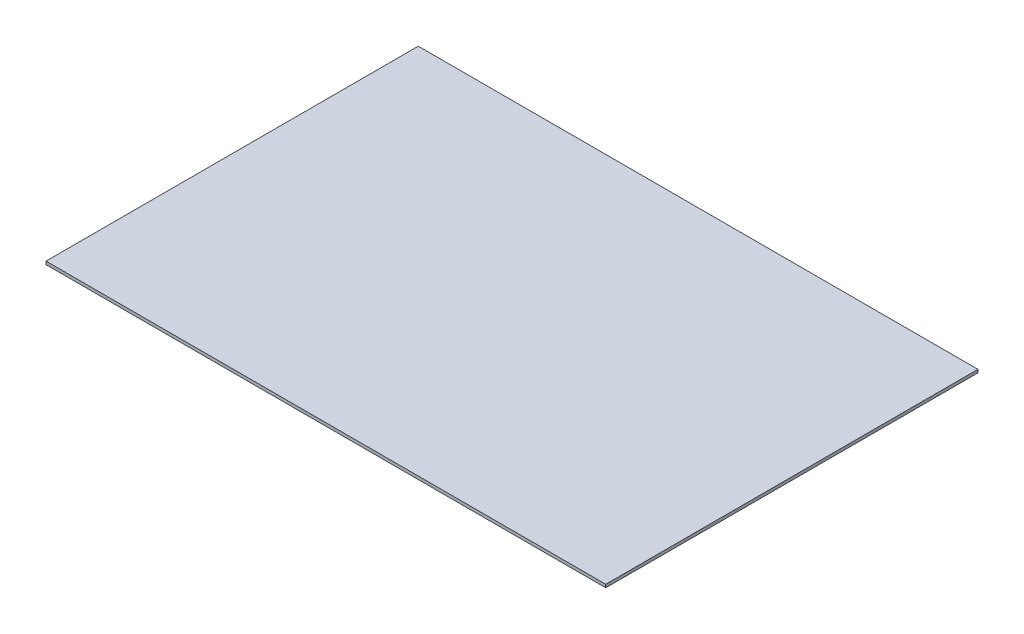
ISO-10303-21;
HEADER;
FILE_DESCRIPTION(('STEP AP214'),'2;1');
FILE_NAME('part.step','',(''),(''),'','','');
FILE_SCHEMA(('AUTOMOTIVE_DESIGN { 1 0 10303 214 1 1 1 1 }'));
ENDSEC;
DATA;
#1=APPLICATION_CONTEXT('core data for automotive mechanical design processes');
#2=APPLICATION_PROTOCOL_DEFINITION('international standard','automotive_design',2000,#1);
#3=PRODUCT_CONTEXT('',#1,'mechanical');
#4=PRODUCT('Part','Part','',(#3));
#5=PRODUCT_RELATED_PRODUCT_CATEGORY('part','',(#4));
#6=PRODUCT_DEFINITION_FORMATION('','',#4);
#7=PRODUCT_DEFINITION_CONTEXT('part definition',#1,'design');
#8=PRODUCT_DEFINITION('design','',#6,#7);
#9=PRODUCT_DEFINITION_SHAPE('','',#8);
#10=(LENGTH_UNIT() NAMED_UNIT(*) SI_UNIT(.MILLI.,.METRE.));
#11=(NAMED_UNIT(*) PLANE_ANGLE_UNIT() SI_UNIT($,.RADIAN.));
#12=(NAMED_UNIT(*) SI_UNIT($,.STERADIAN.) SOLID_ANGLE_UNIT());
#13=UNCERTAINTY_MEASURE_WITH_UNIT(LENGTH_MEASURE(1.E-05),#10,'distance_accuracy_value','');
#14=(GEOMETRIC_REPRESENTATION_CONTEXT(3) GLOBAL_UNCERTAINTY_ASSIGNED_CONTEXT((#13)) GLOBAL_UNIT_ASSIGNED_CONTEXT((#10,
#11,#12)) REPRESENTATION_CONTEXT('',''));
#15=CARTESIAN_POINT('',(0.,0.,0.));
#16=DIRECTION('',(0.,0.,1.));
#17=DIRECTION('',(1.,0.,0.));
#18=AXIS2_PLACEMENT_3D('',#15,#16,#17);
#19=CARTESIAN_POINT('',(-127.598275862069,1.5,-73.7961538461538));
#20=DIRECTION('',(1.,0.,0.));
#21=DIRECTION('',(0.,0.,-1.));
#22=AXIS2_PLACEMENT_3D('',#19,#20,#21);
#23=PLANE('',#22);
#24=DIRECTION('',(0.,0.,1.));
#25=VECTOR('',#24,1.);
#26=CARTESIAN_POINT('',(-127.598275862069,0.,-73.7961538461538));
#27=LINE('',#26,#25);
#28=CARTESIAN_POINT('',(-127.598275862069,0.,-73.7961538461538));
#29=VERTEX_POINT('',#28);
#30=CARTESIAN_POINT('',(-127.598275862069,0.,108.503846153846));
#31=VERTEX_POINT('',#30);
#32=EDGE_CURVE('E98',#29,#31,#27,.T.);
#33=ORIENTED_EDGE('',*,*,#32,.T.);
#34=DIRECTION('',(0.,-1.,0.));
#35=VECTOR('',#34,1.);
#36=CARTESIAN_POINT('',(-127.598275862069,1.5,108.503846153846));
#37=LINE('',#36,#35);
#38=CARTESIAN_POINT('',(-127.598275862069,1.5,108.503846153846));
#39=VERTEX_POINT('',#38);
#40=EDGE_CURVE('E11',#39,#31,#37,.T.);
#41=ORIENTED_EDGE('',*,*,#40,.F.);
#42=DIRECTION('',(0.,0.,1.));
#43=VECTOR('',#42,1.);
#44=CARTESIAN_POINT('',(-127.598275862069,1.5,-73.7961538461538));
#45=LINE('',#44,#43);
#46=CARTESIAN_POINT('',(-127.598275862069,1.5,-73.7961538461538));
#47=VERTEX_POINT('',#46);
#48=EDGE_CURVE('E86',#47,#39,#45,.T.);
#49=ORIENTED_EDGE('',*,*,#48,.F.);
#50=DIRECTION('',(0.,-1.,0.));
#51=VECTOR('',#50,1.);
#52=CARTESIAN_POINT('',(-127.598275862069,1.5,-73.7961538461538));
#53=LINE('',#52,#51);
#54=EDGE_CURVE('E94',#47,#29,#53,.T.);
#55=ORIENTED_EDGE('',*,*,#54,.T.);
#56=EDGE_LOOP('',(#33,#41,#49,#55));
#57=FACE_BOUND('',#56,.T.);
#58=ADVANCED_FACE('F35',(#57),#23,.F.);
#59=CARTESIAN_POINT('',(-127.598275862069,1.5,108.503846153846));
#60=DIRECTION('',(0.,0.,-1.));
#61=DIRECTION('',(-1.,0.,0.));
#62=AXIS2_PLACEMENT_3D('',#59,#60,#61);
#63=PLANE('',#62);
#64=DIRECTION('',(1.,0.,0.));
#65=VECTOR('',#64,1.);
#66=CARTESIAN_POINT('',(-127.598275862069,0.,108.503846153846));
#67=LINE('',#66,#65);
#68=CARTESIAN_POINT('',(146.501724137931,0.,108.503846153846));
#69=VERTEX_POINT('',#68);
#70=EDGE_CURVE('E90',#31,#69,#67,.T.);
#71=ORIENTED_EDGE('',*,*,#70,.T.);
#72=DIRECTION('',(0.,-1.,0.));
#73=VECTOR('',#72,1.);
#74=CARTESIAN_POINT('',(146.501724137931,1.5,108.503846153846));
#75=LINE('',#74,#73);
#76=CARTESIAN_POINT('',(146.501724137931,1.5,108.503846153846));
#77=VERTEX_POINT('',#76);
#78=EDGE_CURVE('E43',#77,#69,#75,.T.);
#79=ORIENTED_EDGE('',*,*,#78,.F.);
#80=DIRECTION('',(1.,0.,0.));
#81=VECTOR('',#80,1.);
#82=CARTESIAN_POINT('',(-127.598275862069,1.5,108.503846153846));
#83=LINE('',#82,#81);
#84=EDGE_CURVE('E81',#39,#77,#83,.T.);
#85=ORIENTED_EDGE('',*,*,#84,.F.);
#86=ORIENTED_EDGE('',*,*,#40,.T.);
#87=EDGE_LOOP('',(#71,#79,#85,#86));
#88=FACE_BOUND('',#87,.T.);
#89=ADVANCED_FACE('F89',(#88),#63,.F.);
#90=CARTESIAN_POINT('',(146.501724137931,1.5,-73.7961538461538));
#91=DIRECTION('',(-1.,0.,0.));
#92=DIRECTION('',(0.,0.,1.));
#93=AXIS2_PLACEMENT_3D('',#90,#91,#92);
#94=PLANE('',#93);
#95=DIRECTION('',(0.,0.,-1.));
#96=VECTOR('',#95,1.);
#97=CARTESIAN_POINT('',(146.501724137931,0.,-73.7961538461538));
#98=LINE('',#97,#96);
#99=CARTESIAN_POINT('',(146.501724137931,0.,-73.7961538461538));
#100=VERTEX_POINT('',#99);
#101=EDGE_CURVE('E68',#69,#100,#98,.T.);
#102=ORIENTED_EDGE('',*,*,#101,.T.);
#103=DIRECTION('',(0.,-1.,0.));
#104=VECTOR('',#103,1.);
#105=CARTESIAN_POINT('',(146.501724137931,1.5,-73.7961538461538));
#106=LINE('',#105,#104);
#107=CARTESIAN_POINT('',(146.501724137931,1.5,-73.7961538461538));
#108=VERTEX_POINT('',#107);
#109=EDGE_CURVE('E91',#108,#100,#106,.T.);
#110=ORIENTED_EDGE('',*,*,#109,.F.);
#111=DIRECTION('',(0.,0.,-1.));
#112=VECTOR('',#111,1.);
#113=CARTESIAN_POINT('',(146.501724137931,1.5,-73.7961538461538));
#114=LINE('',#113,#112);
#115=EDGE_CURVE('E84',#77,#108,#114,.T.);
#116=ORIENTED_EDGE('',*,*,#115,.F.);
#117=ORIENTED_EDGE('',*,*,#78,.T.);
#118=EDGE_LOOP('',(#102,#110,#116,#117));
#119=FACE_BOUND('',#118,.T.);
#120=ADVANCED_FACE('F92',(#119),#94,.F.);
#121=CARTESIAN_POINT('',(-127.598275862069,1.5,-73.7961538461538));
#122=DIRECTION('',(0.,0.,1.));
#123=DIRECTION('',(1.,0.,0.));
#124=AXIS2_PLACEMENT_3D('',#121,#122,#123);
#125=PLANE('',#124);
#126=DIRECTION('',(-1.,0.,0.));
#127=VECTOR('',#126,1.);
#128=CARTESIAN_POINT('',(-127.598275862069,0.,-73.7961538461538));
#129=LINE('',#128,#127);
#130=EDGE_CURVE('E74',#100,#29,#129,.T.);
#131=ORIENTED_EDGE('',*,*,#130,.T.);
#132=ORIENTED_EDGE('',*,*,#54,.F.);
#133=DIRECTION('',(-1.,0.,0.));
#134=VECTOR('',#133,1.);
#135=CARTESIAN_POINT('',(-127.598275862069,1.5,-73.7961538461538));
#136=LINE('',#135,#134);
#137=EDGE_CURVE('E51',#108,#47,#136,.T.);
#138=ORIENTED_EDGE('',*,*,#137,.F.);
#139=ORIENTED_EDGE('',*,*,#109,.T.);
#140=EDGE_LOOP('',(#131,#132,#138,#139));
#141=FACE_BOUND('',#140,.T.);
#142=ADVANCED_FACE('F105',(#141),#125,.F.);
#143=CARTESIAN_POINT('',(0.,1.5,0.));
#144=DIRECTION('',(0.,1.,0.));
#145=DIRECTION('',(0.,0.,1.));
#146=AXIS2_PLACEMENT_3D('',#143,#144,#145);
#147=PLANE('',#146);
#148=ORIENTED_EDGE('',*,*,#48,.T.);
#149=ORIENTED_EDGE('',*,*,#84,.T.);
#150=ORIENTED_EDGE('',*,*,#115,.T.);
#151=ORIENTED_EDGE('',*,*,#137,.T.);
#152=EDGE_LOOP('',(#148,#149,#150,#151));
#153=FACE_BOUND('',#152,.T.);
#154=ADVANCED_FACE('F82',(#153),#147,.T.);
#155=CARTESIAN_POINT('',(0.,0.,0.));
#156=DIRECTION('',(0.,1.,0.));
#157=DIRECTION('',(0.,0.,1.));
#158=AXIS2_PLACEMENT_3D('',#155,#156,#157);
#159=PLANE('',#158);
#160=ORIENTED_EDGE('',*,*,#32,.F.);
#161=ORIENTED_EDGE('',*,*,#130,.F.);
#162=ORIENTED_EDGE('',*,*,#101,.F.);
#163=ORIENTED_EDGE('',*,*,#70,.F.);
#164=EDGE_LOOP('',(#160,#161,#162,#163));
#165=FACE_BOUND('',#164,.T.);
#166=ADVANCED_FACE('F108',(#165),#159,.F.);
#167=CLOSED_SHELL('',(#58,#89,#120,#142,#154,#166));
#168=MANIFOLD_SOLID_BREP('B2',#167);
#169=ADVANCED_BREP_SHAPE_REPRESENTATION('',(#18,#168),#14);
#170=SHAPE_DEFINITION_REPRESENTATION(#9,#169);
ENDSEC;
END-ISO-10303-21;
